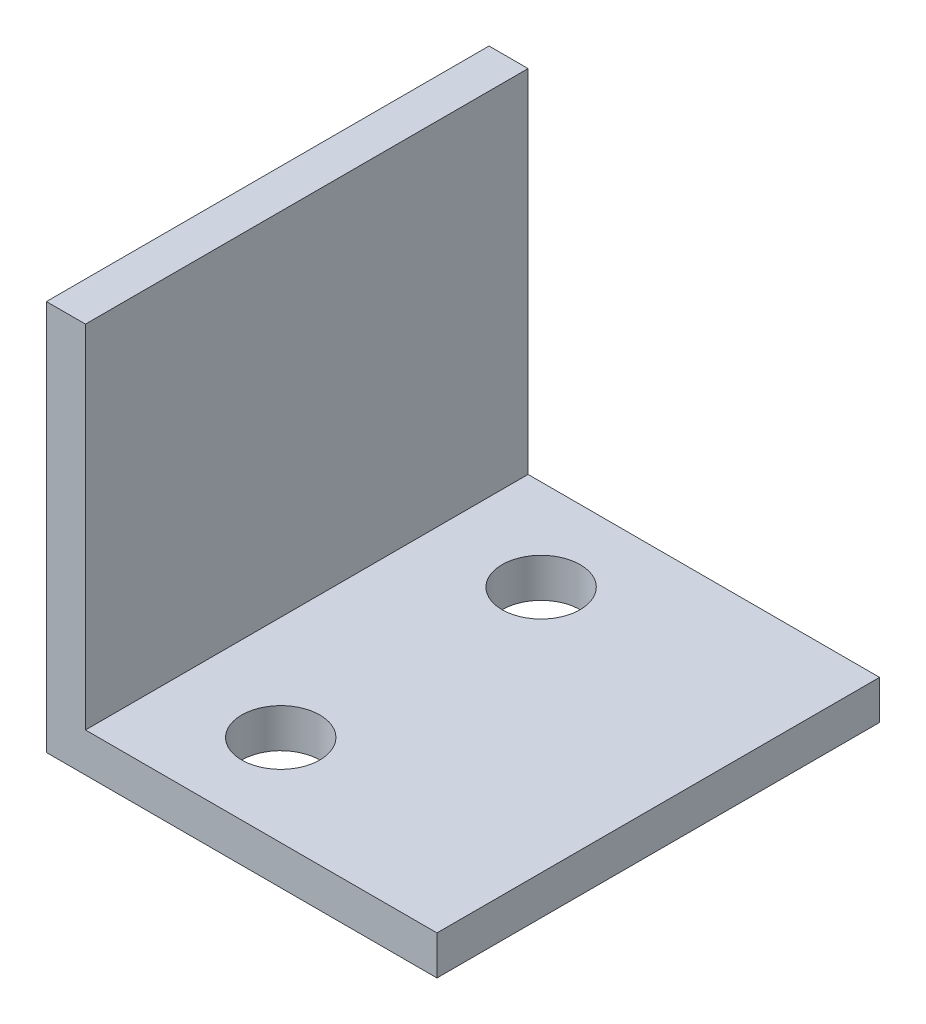
ISO-10303-21;
HEADER;
FILE_DESCRIPTION(('STEP AP214'),'2;1');
FILE_NAME('part.step','',(''),(''),'','','');
FILE_SCHEMA(('AUTOMOTIVE_DESIGN { 1 0 10303 214 1 1 1 1 }'));
ENDSEC;
DATA;
#1=APPLICATION_CONTEXT('core data for automotive mechanical design processes');
#2=APPLICATION_PROTOCOL_DEFINITION('international standard','automotive_design',2000,#1);
#3=PRODUCT_CONTEXT('',#1,'mechanical');
#4=PRODUCT('Part','Part','',(#3));
#5=PRODUCT_RELATED_PRODUCT_CATEGORY('part','',(#4));
#6=PRODUCT_DEFINITION_FORMATION('','',#4);
#7=PRODUCT_DEFINITION_CONTEXT('part definition',#1,'design');
#8=PRODUCT_DEFINITION('design','',#6,#7);
#9=PRODUCT_DEFINITION_SHAPE('','',#8);
#10=(LENGTH_UNIT() NAMED_UNIT(*) SI_UNIT(.MILLI.,.METRE.));
#11=(NAMED_UNIT(*) PLANE_ANGLE_UNIT() SI_UNIT($,.RADIAN.));
#12=(NAMED_UNIT(*) SI_UNIT($,.STERADIAN.) SOLID_ANGLE_UNIT());
#13=UNCERTAINTY_MEASURE_WITH_UNIT(LENGTH_MEASURE(1.E-05),#10,'distance_accuracy_value','');
#14=(GEOMETRIC_REPRESENTATION_CONTEXT(3) GLOBAL_UNCERTAINTY_ASSIGNED_CONTEXT((#13)) GLOBAL_UNIT_ASSIGNED_CONTEXT((#10,
#11,#12)) REPRESENTATION_CONTEXT('',''));
#15=CARTESIAN_POINT('',(0.,0.,0.));
#16=DIRECTION('',(0.,0.,1.));
#17=DIRECTION('',(1.,0.,0.));
#18=AXIS2_PLACEMENT_3D('',#15,#16,#17);
#19=CARTESIAN_POINT('',(-20.4769495377305,-4.54463157894737,17.));
#20=DIRECTION('',(0.,-1.,0.));
#21=DIRECTION('',(0.,0.,-1.));
#22=AXIS2_PLACEMENT_3D('',#19,#20,#21);
#23=PLANE('',#22);
#24=DIRECTION('',(-1.,0.,0.));
#25=VECTOR('',#24,1.);
#26=CARTESIAN_POINT('',(-20.4769495377305,-4.54463157894737,0.));
#27=LINE('',#26,#25);
#28=CARTESIAN_POINT('',(-20.4769495377305,-4.54463157894737,0.));
#29=VERTEX_POINT('',#28);
#30=CARTESIAN_POINT('',(-21.9769495377305,-4.54463157894737,0.));
#31=VERTEX_POINT('',#30);
#32=EDGE_CURVE('E114',#29,#31,#27,.T.);
#33=ORIENTED_EDGE('',*,*,#32,.T.);
#34=DIRECTION('',(0.,0.,-1.));
#35=VECTOR('',#34,1.);
#36=CARTESIAN_POINT('',(-21.9769495377305,-4.54463157894737,17.));
#37=LINE('',#36,#35);
#38=CARTESIAN_POINT('',(-21.9769495377305,-4.54463157894737,17.));
#39=VERTEX_POINT('',#38);
#40=EDGE_CURVE('E11',#39,#31,#37,.T.);
#41=ORIENTED_EDGE('',*,*,#40,.F.);
#42=DIRECTION('',(-1.,0.,0.));
#43=VECTOR('',#42,1.);
#44=CARTESIAN_POINT('',(-20.4769495377305,-4.54463157894737,17.));
#45=LINE('',#44,#43);
#46=CARTESIAN_POINT('',(-20.4769495377305,-4.54463157894737,17.));
#47=VERTEX_POINT('',#46);
#48=EDGE_CURVE('E125',#47,#39,#45,.T.);
#49=ORIENTED_EDGE('',*,*,#48,.F.);
#50=DIRECTION('',(0.,0.,-1.));
#51=VECTOR('',#50,1.);
#52=CARTESIAN_POINT('',(-20.4769495377305,-4.54463157894737,17.));
#53=LINE('',#52,#51);
#54=EDGE_CURVE('E110',#47,#29,#53,.T.);
#55=ORIENTED_EDGE('',*,*,#54,.T.);
#56=EDGE_LOOP('',(#33,#41,#49,#55));
#57=FACE_BOUND('',#56,.T.);
#58=ADVANCED_FACE('F30',(#57),#23,.F.);
#59=CARTESIAN_POINT('',(-21.9769495377305,-4.54463157894737,17.));
#60=DIRECTION('',(1.,0.,0.));
#61=DIRECTION('',(0.,1.,0.));
#62=AXIS2_PLACEMENT_3D('',#59,#60,#61);
#63=PLANE('',#62);
#64=DIRECTION('',(0.,-1.,0.));
#65=VECTOR('',#64,1.);
#66=CARTESIAN_POINT('',(-21.9769495377305,-4.54463157894737,0.));
#67=LINE('',#66,#65);
#68=CARTESIAN_POINT('',(-21.9769495377305,-19.5446315789474,0.));
#69=VERTEX_POINT('',#68);
#70=EDGE_CURVE('E117',#31,#69,#67,.T.);
#71=ORIENTED_EDGE('',*,*,#70,.T.);
#72=DIRECTION('',(0.,0.,-1.));
#73=VECTOR('',#72,1.);
#74=CARTESIAN_POINT('',(-21.9769495377305,-19.5446315789474,17.));
#75=LINE('',#74,#73);
#76=CARTESIAN_POINT('',(-21.9769495377305,-19.5446315789474,17.));
#77=VERTEX_POINT('',#76);
#78=EDGE_CURVE('E38',#77,#69,#75,.T.);
#79=ORIENTED_EDGE('',*,*,#78,.F.);
#80=DIRECTION('',(0.,-1.,0.));
#81=VECTOR('',#80,1.);
#82=CARTESIAN_POINT('',(-21.9769495377305,-4.54463157894737,17.));
#83=LINE('',#82,#81);
#84=EDGE_CURVE('E83',#39,#77,#83,.T.);
#85=ORIENTED_EDGE('',*,*,#84,.F.);
#86=ORIENTED_EDGE('',*,*,#40,.T.);
#87=EDGE_LOOP('',(#71,#79,#85,#86));
#88=FACE_BOUND('',#87,.T.);
#89=ADVANCED_FACE('F150',(#88),#63,.F.);
#90=CARTESIAN_POINT('',(-21.9769495377305,-19.5446315789474,17.));
#91=DIRECTION('',(0.,1.,0.));
#92=DIRECTION('',(0.,0.,1.));
#93=AXIS2_PLACEMENT_3D('',#90,#91,#92);
#94=PLANE('',#93);
#95=CARTESIAN_POINT('',(-16.4769495377305,-19.5446315789474,3.5));
#96=DIRECTION('',(0.,1.,0.));
#97=DIRECTION('',(0.,0.,1.));
#98=AXIS2_PLACEMENT_3D('',#95,#96,#97);
#99=CIRCLE('',#98,1.5);
#100=CARTESIAN_POINT('',(-16.4769495377305,-19.5446315789474,5.));
#101=VERTEX_POINT('',#100);
#102=EDGE_CURVE('E218',#101,#101,#99,.T.);
#103=ORIENTED_EDGE('',*,*,#102,.T.);
#104=EDGE_LOOP('',(#103));
#105=FACE_BOUND('',#104,.T.);
#106=CARTESIAN_POINT('',(-16.4769495377305,-19.5446315789474,13.5));
#107=DIRECTION('',(0.,1.,0.));
#108=DIRECTION('',(0.,0.,1.));
#109=AXIS2_PLACEMENT_3D('',#106,#107,#108);
#110=CIRCLE('',#109,1.5);
#111=CARTESIAN_POINT('',(-16.4769495377305,-19.5446315789474,15.));
#112=VERTEX_POINT('',#111);
#113=EDGE_CURVE('E118',#112,#112,#110,.T.);
#114=ORIENTED_EDGE('',*,*,#113,.T.);
#115=EDGE_LOOP('',(#114));
#116=FACE_BOUND('',#115,.T.);
#117=DIRECTION('',(1.,0.,0.));
#118=VECTOR('',#117,1.);
#119=CARTESIAN_POINT('',(-21.9769495377305,-19.5446315789474,0.));
#120=LINE('',#119,#118);
#121=CARTESIAN_POINT('',(-6.9769495377305,-19.5446315789474,0.));
#122=VERTEX_POINT('',#121);
#123=EDGE_CURVE('E120',#69,#122,#120,.T.);
#124=ORIENTED_EDGE('',*,*,#123,.T.);
#125=DIRECTION('',(0.,0.,-1.));
#126=VECTOR('',#125,1.);
#127=CARTESIAN_POINT('',(-6.9769495377305,-19.5446315789474,17.));
#128=LINE('',#127,#126);
#129=CARTESIAN_POINT('',(-6.9769495377305,-19.5446315789474,17.));
#130=VERTEX_POINT('',#129);
#131=EDGE_CURVE('E105',#130,#122,#128,.T.);
#132=ORIENTED_EDGE('',*,*,#131,.F.);
#133=DIRECTION('',(1.,0.,0.));
#134=VECTOR('',#133,1.);
#135=CARTESIAN_POINT('',(-21.9769495377305,-19.5446315789474,17.));
#136=LINE('',#135,#134);
#137=EDGE_CURVE('E96',#77,#130,#136,.T.);
#138=ORIENTED_EDGE('',*,*,#137,.F.);
#139=ORIENTED_EDGE('',*,*,#78,.T.);
#140=EDGE_LOOP('',(#124,#132,#138,#139));
#141=FACE_BOUND('',#140,.T.);
#142=ADVANCED_FACE('F131',(#105,#116,#141),#94,.F.);
#143=CARTESIAN_POINT('',(-6.9769495377305,-19.5446315789474,17.));
#144=DIRECTION('',(-1.,0.,0.));
#145=DIRECTION('',(0.,0.,1.));
#146=AXIS2_PLACEMENT_3D('',#143,#144,#145);
#147=PLANE('',#146);
#148=DIRECTION('',(0.,1.,0.));
#149=VECTOR('',#148,1.);
#150=CARTESIAN_POINT('',(-6.9769495377305,-19.5446315789474,0.));
#151=LINE('',#150,#149);
#152=CARTESIAN_POINT('',(-6.9769495377305,-18.0446315789474,0.));
#153=VERTEX_POINT('',#152);
#154=EDGE_CURVE('E104',#122,#153,#151,.T.);
#155=ORIENTED_EDGE('',*,*,#154,.T.);
#156=DIRECTION('',(0.,0.,-1.));
#157=VECTOR('',#156,1.);
#158=CARTESIAN_POINT('',(-6.9769495377305,-18.0446315789474,17.));
#159=LINE('',#158,#157);
#160=CARTESIAN_POINT('',(-6.9769495377305,-18.0446315789474,17.));
#161=VERTEX_POINT('',#160);
#162=EDGE_CURVE('E101',#161,#153,#159,.T.);
#163=ORIENTED_EDGE('',*,*,#162,.F.);
#164=DIRECTION('',(0.,1.,0.));
#165=VECTOR('',#164,1.);
#166=CARTESIAN_POINT('',(-6.9769495377305,-19.5446315789474,17.));
#167=LINE('',#166,#165);
#168=EDGE_CURVE('E90',#130,#161,#167,.T.);
#169=ORIENTED_EDGE('',*,*,#168,.F.);
#170=ORIENTED_EDGE('',*,*,#131,.T.);
#171=EDGE_LOOP('',(#155,#163,#169,#170));
#172=FACE_BOUND('',#171,.T.);
#173=ADVANCED_FACE('F102',(#172),#147,.F.);
#174=CARTESIAN_POINT('',(-6.9769495377305,-18.0446315789474,17.));
#175=DIRECTION('',(0.,-1.,0.));
#176=DIRECTION('',(1.,0.,0.));
#177=AXIS2_PLACEMENT_3D('',#174,#175,#176);
#178=PLANE('',#177);
#179=CARTESIAN_POINT('',(-16.4769495377305,-18.0446315789474,3.5));
#180=DIRECTION('',(0.,1.,0.));
#181=DIRECTION('',(-1.,0.,0.));
#182=AXIS2_PLACEMENT_3D('',#179,#180,#181);
#183=CIRCLE('',#182,1.5);
#184=CARTESIAN_POINT('',(-17.9769495377305,-18.0446315789474,3.5));
#185=VERTEX_POINT('',#184);
#186=EDGE_CURVE('E215',#185,#185,#183,.T.);
#187=ORIENTED_EDGE('',*,*,#186,.F.);
#188=EDGE_LOOP('',(#187));
#189=FACE_BOUND('',#188,.T.);
#190=CARTESIAN_POINT('',(-16.4769495377305,-18.0446315789474,13.5));
#191=DIRECTION('',(0.,1.,0.));
#192=DIRECTION('',(-1.,0.,0.));
#193=AXIS2_PLACEMENT_3D('',#190,#191,#192);
#194=CIRCLE('',#193,1.5);
#195=CARTESIAN_POINT('',(-17.9769495377305,-18.0446315789474,13.5));
#196=VERTEX_POINT('',#195);
#197=EDGE_CURVE('E219',#196,#196,#194,.T.);
#198=ORIENTED_EDGE('',*,*,#197,.F.);
#199=EDGE_LOOP('',(#198));
#200=FACE_BOUND('',#199,.T.);
#201=DIRECTION('',(-1.,0.,0.));
#202=VECTOR('',#201,1.);
#203=CARTESIAN_POINT('',(-6.9769495377305,-18.0446315789474,0.));
#204=LINE('',#203,#202);
#205=CARTESIAN_POINT('',(-20.4769495377305,-18.0446315789474,0.));
#206=VERTEX_POINT('',#205);
#207=EDGE_CURVE('E69',#153,#206,#204,.T.);
#208=ORIENTED_EDGE('',*,*,#207,.T.);
#209=DIRECTION('',(0.,0.,-1.));
#210=VECTOR('',#209,1.);
#211=CARTESIAN_POINT('',(-20.4769495377305,-18.0446315789474,17.));
#212=LINE('',#211,#210);
#213=CARTESIAN_POINT('',(-20.4769495377305,-18.0446315789474,17.));
#214=VERTEX_POINT('',#213);
#215=EDGE_CURVE('E106',#214,#206,#212,.T.);
#216=ORIENTED_EDGE('',*,*,#215,.F.);
#217=DIRECTION('',(-1.,0.,0.));
#218=VECTOR('',#217,1.);
#219=CARTESIAN_POINT('',(-6.9769495377305,-18.0446315789474,17.));
#220=LINE('',#219,#218);
#221=EDGE_CURVE('E94',#161,#214,#220,.T.);
#222=ORIENTED_EDGE('',*,*,#221,.F.);
#223=ORIENTED_EDGE('',*,*,#162,.T.);
#224=EDGE_LOOP('',(#208,#216,#222,#223));
#225=FACE_BOUND('',#224,.T.);
#226=ADVANCED_FACE('F108',(#189,#200,#225),#178,.F.);
#227=CARTESIAN_POINT('',(-20.4769495377305,-18.0446315789474,17.));
#228=DIRECTION('',(-1.,0.,0.));
#229=DIRECTION('',(0.,-1.,0.));
#230=AXIS2_PLACEMENT_3D('',#227,#228,#229);
#231=PLANE('',#230);
#232=DIRECTION('',(0.,1.,0.));
#233=VECTOR('',#232,1.);
#234=CARTESIAN_POINT('',(-20.4769495377305,-18.0446315789474,0.));
#235=LINE('',#234,#233);
#236=EDGE_CURVE('E75',#206,#29,#235,.T.);
#237=ORIENTED_EDGE('',*,*,#236,.T.);
#238=ORIENTED_EDGE('',*,*,#54,.F.);
#239=DIRECTION('',(0.,1.,0.));
#240=VECTOR('',#239,1.);
#241=CARTESIAN_POINT('',(-20.4769495377305,-18.0446315789474,17.));
#242=LINE('',#241,#240);
#243=EDGE_CURVE('E46',#214,#47,#242,.T.);
#244=ORIENTED_EDGE('',*,*,#243,.F.);
#245=ORIENTED_EDGE('',*,*,#215,.T.);
#246=EDGE_LOOP('',(#237,#238,#244,#245));
#247=FACE_BOUND('',#246,.T.);
#248=ADVANCED_FACE('F138',(#247),#231,.F.);
#249=CARTESIAN_POINT('',(-21.9769495377305,-4.54463157894737,17.));
#250=DIRECTION('',(0.,0.,1.));
#251=DIRECTION('',(1.,0.,0.));
#252=AXIS2_PLACEMENT_3D('',#249,#250,#251);
#253=PLANE('',#252);
#254=ORIENTED_EDGE('',*,*,#48,.T.);
#255=ORIENTED_EDGE('',*,*,#84,.T.);
#256=ORIENTED_EDGE('',*,*,#137,.T.);
#257=ORIENTED_EDGE('',*,*,#168,.T.);
#258=ORIENTED_EDGE('',*,*,#221,.T.);
#259=ORIENTED_EDGE('',*,*,#243,.T.);
#260=EDGE_LOOP('',(#254,#255,#256,#257,#258,#259));
#261=FACE_BOUND('',#260,.T.);
#262=ADVANCED_FACE('F92',(#261),#253,.T.);
#263=CARTESIAN_POINT('',(-21.9769495377305,-4.54463157894737,0.));
#264=DIRECTION('',(0.,0.,1.));
#265=DIRECTION('',(1.,0.,0.));
#266=AXIS2_PLACEMENT_3D('',#263,#264,#265);
#267=PLANE('',#266);
#268=ORIENTED_EDGE('',*,*,#32,.F.);
#269=ORIENTED_EDGE('',*,*,#236,.F.);
#270=ORIENTED_EDGE('',*,*,#207,.F.);
#271=ORIENTED_EDGE('',*,*,#154,.F.);
#272=ORIENTED_EDGE('',*,*,#123,.F.);
#273=ORIENTED_EDGE('',*,*,#70,.F.);
#274=EDGE_LOOP('',(#268,#269,#270,#271,#272,#273));
#275=FACE_BOUND('',#274,.T.);
#276=ADVANCED_FACE('F134',(#275),#267,.F.);
#277=CARTESIAN_POINT('',(-16.4769495377305,-33.0446315789474,13.5));
#278=DIRECTION('',(0.,1.,0.));
#279=DIRECTION('',(-1.,0.,0.));
#280=AXIS2_PLACEMENT_3D('',#277,#278,#279);
#281=CYLINDRICAL_SURFACE('',#280,1.5);
#282=ORIENTED_EDGE('',*,*,#197,.T.);
#283=EDGE_LOOP('',(#282));
#284=FACE_BOUND('',#283,.T.);
#285=ORIENTED_EDGE('',*,*,#113,.F.);
#286=EDGE_LOOP('',(#285));
#287=FACE_BOUND('',#286,.T.);
#288=ADVANCED_FACE('F178',(#284,#287),#281,.F.);
#289=CARTESIAN_POINT('',(-16.4769495377305,-33.0446315789474,3.5));
#290=DIRECTION('',(0.,1.,0.));
#291=DIRECTION('',(-1.,0.,0.));
#292=AXIS2_PLACEMENT_3D('',#289,#290,#291);
#293=CYLINDRICAL_SURFACE('',#292,1.5);
#294=ORIENTED_EDGE('',*,*,#186,.T.);
#295=EDGE_LOOP('',(#294));
#296=FACE_BOUND('',#295,.T.);
#297=ORIENTED_EDGE('',*,*,#102,.F.);
#298=EDGE_LOOP('',(#297));
#299=FACE_BOUND('',#298,.T.);
#300=ADVANCED_FACE('F183',(#296,#299),#293,.F.);
#301=CLOSED_SHELL('',(#58,#89,#142,#173,#226,#248,#262,#276,#288,#300));
#302=MANIFOLD_SOLID_BREP('B2',#301);
#303=ADVANCED_BREP_SHAPE_REPRESENTATION('',(#18,#302),#14);
#304=SHAPE_DEFINITION_REPRESENTATION(#9,#303);
ENDSEC;
END-ISO-10303-21;
